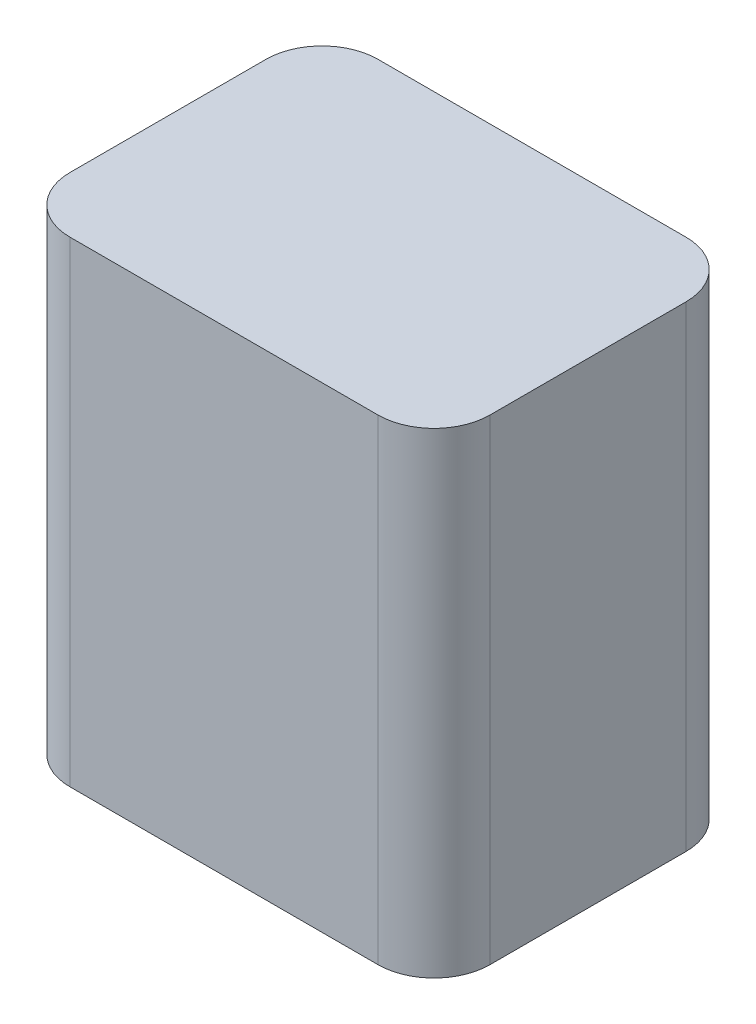
ISO-10303-21;
HEADER;
FILE_DESCRIPTION(('STEP AP214'),'2;1');
FILE_NAME('part.step','',(''),(''),'','','');
FILE_SCHEMA(('AUTOMOTIVE_DESIGN { 1 0 10303 214 1 1 1 1 }'));
ENDSEC;
DATA;
#1=APPLICATION_CONTEXT('core data for automotive mechanical design processes');
#2=APPLICATION_PROTOCOL_DEFINITION('international standard','automotive_design',2000,#1);
#3=PRODUCT_CONTEXT('',#1,'mechanical');
#4=PRODUCT('Part','Part','',(#3));
#5=PRODUCT_RELATED_PRODUCT_CATEGORY('part','',(#4));
#6=PRODUCT_DEFINITION_FORMATION('','',#4);
#7=PRODUCT_DEFINITION_CONTEXT('part definition',#1,'design');
#8=PRODUCT_DEFINITION('design','',#6,#7);
#9=PRODUCT_DEFINITION_SHAPE('','',#8);
#10=(LENGTH_UNIT() NAMED_UNIT(*) SI_UNIT(.MILLI.,.METRE.));
#11=(NAMED_UNIT(*) PLANE_ANGLE_UNIT() SI_UNIT($,.RADIAN.));
#12=(NAMED_UNIT(*) SI_UNIT($,.STERADIAN.) SOLID_ANGLE_UNIT());
#13=UNCERTAINTY_MEASURE_WITH_UNIT(LENGTH_MEASURE(1.E-05),#10,'distance_accuracy_value','');
#14=(GEOMETRIC_REPRESENTATION_CONTEXT(3) GLOBAL_UNCERTAINTY_ASSIGNED_CONTEXT((#13)) GLOBAL_UNIT_ASSIGNED_CONTEXT((#10,
#11,#12)) REPRESENTATION_CONTEXT('',''));
#15=CARTESIAN_POINT('',(0.,0.,0.));
#16=DIRECTION('',(0.,0.,1.));
#17=DIRECTION('',(1.,0.,0.));
#18=AXIS2_PLACEMENT_3D('',#15,#16,#17);
#19=CARTESIAN_POINT('',(-20.5199783886653,8.53159851301115,11.));
#20=DIRECTION('',(1.,0.,0.));
#21=DIRECTION('',(0.,0.,-1.));
#22=AXIS2_PLACEMENT_3D('',#19,#20,#21);
#23=PLANE('',#22);
#24=DIRECTION('',(0.,0.,-1.));
#25=VECTOR('',#24,1.);
#26=CARTESIAN_POINT('',(-20.5199783886653,8.53159851301115,11.));
#27=LINE('',#26,#25);
#28=CARTESIAN_POINT('',(-20.5199783886653,8.53159851301115,9.));
#29=VERTEX_POINT('',#28);
#30=CARTESIAN_POINT('',(-20.5199783886653,8.53159851301115,2.));
#31=VERTEX_POINT('',#30);
#32=EDGE_CURVE('E120',#29,#31,#27,.T.);
#33=ORIENTED_EDGE('',*,*,#32,.T.);
#34=DIRECTION('',(0.,-1.,0.));
#35=VECTOR('',#34,1.);
#36=CARTESIAN_POINT('',(-20.5199783886653,8.53159851301115,2.));
#37=LINE('',#36,#35);
#38=CARTESIAN_POINT('',(-20.5199783886653,-8.46840148698885,2.));
#39=VERTEX_POINT('',#38);
#40=EDGE_CURVE('E11',#31,#39,#37,.T.);
#41=ORIENTED_EDGE('',*,*,#40,.T.);
#42=DIRECTION('',(0.,0.,-1.));
#43=VECTOR('',#42,1.);
#44=CARTESIAN_POINT('',(-20.5199783886653,-8.46840148698885,11.));
#45=LINE('',#44,#43);
#46=CARTESIAN_POINT('',(-20.5199783886653,-8.46840148698885,9.));
#47=VERTEX_POINT('',#46);
#48=EDGE_CURVE('E125',#47,#39,#45,.T.);
#49=ORIENTED_EDGE('',*,*,#48,.F.);
#50=DIRECTION('',(0.,-1.,0.));
#51=VECTOR('',#50,1.);
#52=CARTESIAN_POINT('',(-20.5199783886653,8.53159851301115,9.));
#53=LINE('',#52,#51);
#54=EDGE_CURVE('E40',#47,#29,#53,.F.);
#55=ORIENTED_EDGE('',*,*,#54,.T.);
#56=EDGE_LOOP('',(#33,#41,#49,#55));
#57=FACE_BOUND('',#56,.T.);
#58=ADVANCED_FACE('F32',(#57),#23,.F.);
#59=CARTESIAN_POINT('',(-20.5199783886653,-8.46840148698885,11.));
#60=DIRECTION('',(0.,1.,0.));
#61=DIRECTION('',(-1.,0.,0.));
#62=AXIS2_PLACEMENT_3D('',#59,#60,#61);
#63=PLANE('',#62);
#64=DIRECTION('',(1.,0.,0.));
#65=VECTOR('',#64,1.);
#66=CARTESIAN_POINT('',(-20.5199783886653,-8.46840148698885,0.));
#67=LINE('',#66,#65);
#68=CARTESIAN_POINT('',(-18.5199783886653,-8.46840148698885,0.));
#69=VERTEX_POINT('',#68);
#70=CARTESIAN_POINT('',(-7.51997838866533,-8.46840148698885,0.));
#71=VERTEX_POINT('',#70);
#72=EDGE_CURVE('E167',#69,#71,#67,.T.);
#73=ORIENTED_EDGE('',*,*,#72,.T.);
#74=CARTESIAN_POINT('',(-7.51997838866533,-8.46840148698885,2.));
#75=DIRECTION('',(0.,1.,0.));
#76=DIRECTION('',(-1.,0.,0.));
#77=AXIS2_PLACEMENT_3D('',#74,#75,#76);
#78=CIRCLE('',#77,2.);
#79=CARTESIAN_POINT('',(-5.51997838866533,-8.46840148698885,2.));
#80=VERTEX_POINT('',#79);
#81=EDGE_CURVE('E142',#71,#80,#78,.F.);
#82=ORIENTED_EDGE('',*,*,#81,.T.);
#83=DIRECTION('',(0.,0.,-1.));
#84=VECTOR('',#83,1.);
#85=CARTESIAN_POINT('',(-5.51997838866533,-8.46840148698885,11.));
#86=LINE('',#85,#84);
#87=CARTESIAN_POINT('',(-5.51997838866533,-8.46840148698885,9.));
#88=VERTEX_POINT('',#87);
#89=EDGE_CURVE('E119',#88,#80,#86,.T.);
#90=ORIENTED_EDGE('',*,*,#89,.F.);
#91=CARTESIAN_POINT('',(-7.51997838866533,-8.46840148698885,9.));
#92=DIRECTION('',(0.,1.,0.));
#93=DIRECTION('',(-1.,0.,0.));
#94=AXIS2_PLACEMENT_3D('',#91,#92,#93);
#95=CIRCLE('',#94,2.);
#96=CARTESIAN_POINT('',(-7.51997838866533,-8.46840148698885,11.));
#97=VERTEX_POINT('',#96);
#98=EDGE_CURVE('E124',#88,#97,#95,.F.);
#99=ORIENTED_EDGE('',*,*,#98,.T.);
#100=DIRECTION('',(1.,0.,0.));
#101=VECTOR('',#100,1.);
#102=CARTESIAN_POINT('',(-20.5199783886653,-8.46840148698885,11.));
#103=LINE('',#102,#101);
#104=CARTESIAN_POINT('',(-18.5199783886653,-8.46840148698885,11.));
#105=VERTEX_POINT('',#104);
#106=EDGE_CURVE('E161',#105,#97,#103,.T.);
#107=ORIENTED_EDGE('',*,*,#106,.F.);
#108=CARTESIAN_POINT('',(-18.5199783886653,-8.46840148698885,9.));
#109=DIRECTION('',(0.,1.,0.));
#110=DIRECTION('',(-1.,0.,0.));
#111=AXIS2_PLACEMENT_3D('',#108,#109,#110);
#112=CIRCLE('',#111,2.);
#113=EDGE_CURVE('E54',#105,#47,#112,.F.);
#114=ORIENTED_EDGE('',*,*,#113,.T.);
#115=ORIENTED_EDGE('',*,*,#48,.T.);
#116=CARTESIAN_POINT('',(-18.5199783886653,-8.46840148698885,2.));
#117=DIRECTION('',(0.,1.,0.));
#118=DIRECTION('',(-1.,0.,0.));
#119=AXIS2_PLACEMENT_3D('',#116,#117,#118);
#120=CIRCLE('',#119,2.);
#121=EDGE_CURVE('E47',#39,#69,#120,.F.);
#122=ORIENTED_EDGE('',*,*,#121,.T.);
#123=EDGE_LOOP('',(#73,#82,#90,#99,#107,#114,#115,#122));
#124=FACE_BOUND('',#123,.T.);
#125=ADVANCED_FACE('F163',(#124),#63,.F.);
#126=CARTESIAN_POINT('',(-5.51997838866533,8.53159851301115,11.));
#127=DIRECTION('',(-1.,0.,0.));
#128=DIRECTION('',(0.,0.,1.));
#129=AXIS2_PLACEMENT_3D('',#126,#127,#128);
#130=PLANE('',#129);
#131=ORIENTED_EDGE('',*,*,#89,.T.);
#132=DIRECTION('',(0.,1.,0.));
#133=VECTOR('',#132,1.);
#134=CARTESIAN_POINT('',(-5.51997838866533,8.53159851301115,2.));
#135=LINE('',#134,#133);
#136=CARTESIAN_POINT('',(-5.51997838866533,8.53159851301115,2.));
#137=VERTEX_POINT('',#136);
#138=EDGE_CURVE('E118',#80,#137,#135,.T.);
#139=ORIENTED_EDGE('',*,*,#138,.T.);
#140=DIRECTION('',(0.,0.,-1.));
#141=VECTOR('',#140,1.);
#142=CARTESIAN_POINT('',(-5.51997838866533,8.53159851301115,11.));
#143=LINE('',#142,#141);
#144=CARTESIAN_POINT('',(-5.51997838866533,8.53159851301115,9.));
#145=VERTEX_POINT('',#144);
#146=EDGE_CURVE('E101',#145,#137,#143,.T.);
#147=ORIENTED_EDGE('',*,*,#146,.F.);
#148=DIRECTION('',(0.,1.,0.));
#149=VECTOR('',#148,1.);
#150=CARTESIAN_POINT('',(-5.51997838866533,-8.46840148698885,9.));
#151=LINE('',#150,#149);
#152=EDGE_CURVE('E115',#145,#88,#151,.F.);
#153=ORIENTED_EDGE('',*,*,#152,.T.);
#154=EDGE_LOOP('',(#131,#139,#147,#153));
#155=FACE_BOUND('',#154,.T.);
#156=ADVANCED_FACE('F114',(#155),#130,.F.);
#157=CARTESIAN_POINT('',(-20.5199783886653,8.53159851301115,11.));
#158=DIRECTION('',(0.,-1.,0.));
#159=DIRECTION('',(0.,0.,-1.));
#160=AXIS2_PLACEMENT_3D('',#157,#158,#159);
#161=PLANE('',#160);
#162=ORIENTED_EDGE('',*,*,#146,.T.);
#163=CARTESIAN_POINT('',(-7.51997838866533,8.53159851301115,2.));
#164=DIRECTION('',(0.,-1.,0.));
#165=DIRECTION('',(0.,0.,-1.));
#166=AXIS2_PLACEMENT_3D('',#163,#164,#165);
#167=CIRCLE('',#166,2.);
#168=CARTESIAN_POINT('',(-7.51997838866533,8.53159851301115,0.));
#169=VERTEX_POINT('',#168);
#170=EDGE_CURVE('E108',#137,#169,#167,.F.);
#171=ORIENTED_EDGE('',*,*,#170,.T.);
#172=DIRECTION('',(-1.,0.,0.));
#173=VECTOR('',#172,1.);
#174=CARTESIAN_POINT('',(-20.5199783886653,8.53159851301115,0.));
#175=LINE('',#174,#173);
#176=CARTESIAN_POINT('',(-18.5199783886653,8.53159851301115,0.));
#177=VERTEX_POINT('',#176);
#178=EDGE_CURVE('E164',#169,#177,#175,.T.);
#179=ORIENTED_EDGE('',*,*,#178,.T.);
#180=CARTESIAN_POINT('',(-18.5199783886653,8.53159851301115,2.));
#181=DIRECTION('',(0.,-1.,0.));
#182=DIRECTION('',(0.,0.,-1.));
#183=AXIS2_PLACEMENT_3D('',#180,#181,#182);
#184=CIRCLE('',#183,2.);
#185=EDGE_CURVE('E109',#177,#31,#184,.F.);
#186=ORIENTED_EDGE('',*,*,#185,.T.);
#187=ORIENTED_EDGE('',*,*,#32,.F.);
#188=CARTESIAN_POINT('',(-18.5199783886653,8.53159851301115,9.));
#189=DIRECTION('',(0.,-1.,0.));
#190=DIRECTION('',(0.,0.,-1.));
#191=AXIS2_PLACEMENT_3D('',#188,#189,#190);
#192=CIRCLE('',#191,2.);
#193=CARTESIAN_POINT('',(-18.5199783886653,8.53159851301115,11.));
#194=VERTEX_POINT('',#193);
#195=EDGE_CURVE('E127',#29,#194,#192,.F.);
#196=ORIENTED_EDGE('',*,*,#195,.T.);
#197=DIRECTION('',(-1.,0.,0.));
#198=VECTOR('',#197,1.);
#199=CARTESIAN_POINT('',(-20.5199783886653,8.53159851301115,11.));
#200=LINE('',#199,#198);
#201=CARTESIAN_POINT('',(-7.51997838866533,8.53159851301115,11.));
#202=VERTEX_POINT('',#201);
#203=EDGE_CURVE('E103',#202,#194,#200,.T.);
#204=ORIENTED_EDGE('',*,*,#203,.F.);
#205=CARTESIAN_POINT('',(-7.51997838866533,8.53159851301115,9.));
#206=DIRECTION('',(0.,-1.,0.));
#207=DIRECTION('',(0.,0.,-1.));
#208=AXIS2_PLACEMENT_3D('',#205,#206,#207);
#209=CIRCLE('',#208,2.);
#210=EDGE_CURVE('E98',#202,#145,#209,.F.);
#211=ORIENTED_EDGE('',*,*,#210,.T.);
#212=EDGE_LOOP('',(#162,#171,#179,#186,#187,#196,#204,#211));
#213=FACE_BOUND('',#212,.T.);
#214=ADVANCED_FACE('F100',(#213),#161,.F.);
#215=CARTESIAN_POINT('',(0.,0.,11.));
#216=DIRECTION('',(0.,0.,1.));
#217=DIRECTION('',(1.,0.,0.));
#218=AXIS2_PLACEMENT_3D('',#215,#216,#217);
#219=PLANE('',#218);
#220=ORIENTED_EDGE('',*,*,#106,.T.);
#221=DIRECTION('',(0.,1.,0.));
#222=VECTOR('',#221,1.);
#223=CARTESIAN_POINT('',(-7.51997838866533,8.53159851301115,11.));
#224=LINE('',#223,#222);
#225=EDGE_CURVE('E147',#97,#202,#224,.T.);
#226=ORIENTED_EDGE('',*,*,#225,.T.);
#227=ORIENTED_EDGE('',*,*,#203,.T.);
#228=DIRECTION('',(0.,-1.,0.));
#229=VECTOR('',#228,1.);
#230=CARTESIAN_POINT('',(-18.5199783886653,-8.46840148698885,11.));
#231=LINE('',#230,#229);
#232=EDGE_CURVE('E144',#194,#105,#231,.T.);
#233=ORIENTED_EDGE('',*,*,#232,.T.);
#234=EDGE_LOOP('',(#220,#226,#227,#233));
#235=FACE_BOUND('',#234,.T.);
#236=ADVANCED_FACE('F160',(#235),#219,.T.);
#237=CARTESIAN_POINT('',(0.,0.,0.));
#238=DIRECTION('',(0.,0.,1.));
#239=DIRECTION('',(1.,0.,0.));
#240=AXIS2_PLACEMENT_3D('',#237,#238,#239);
#241=PLANE('',#240);
#242=ORIENTED_EDGE('',*,*,#178,.F.);
#243=DIRECTION('',(0.,1.,0.));
#244=VECTOR('',#243,1.);
#245=CARTESIAN_POINT('',(-7.51997838866533,0.,0.));
#246=LINE('',#245,#244);
#247=EDGE_CURVE('E137',#169,#71,#246,.F.);
#248=ORIENTED_EDGE('',*,*,#247,.T.);
#249=ORIENTED_EDGE('',*,*,#72,.F.);
#250=DIRECTION('',(0.,-1.,0.));
#251=VECTOR('',#250,1.);
#252=CARTESIAN_POINT('',(-18.5199783886653,0.,0.));
#253=LINE('',#252,#251);
#254=EDGE_CURVE('E135',#69,#177,#253,.F.);
#255=ORIENTED_EDGE('',*,*,#254,.T.);
#256=EDGE_LOOP('',(#242,#248,#249,#255));
#257=FACE_BOUND('',#256,.T.);
#258=ADVANCED_FACE('F176',(#257),#241,.F.);
#259=CARTESIAN_POINT('',(-7.51997838866533,8.53159851301115,2.));
#260=DIRECTION('',(0.,1.,0.));
#261=DIRECTION('',(0.,0.,1.));
#262=AXIS2_PLACEMENT_3D('',#259,#260,#261);
#263=CYLINDRICAL_SURFACE('',#262,2.);
#264=ORIENTED_EDGE('',*,*,#81,.F.);
#265=ORIENTED_EDGE('',*,*,#247,.F.);
#266=ORIENTED_EDGE('',*,*,#170,.F.);
#267=ORIENTED_EDGE('',*,*,#138,.F.);
#268=EDGE_LOOP('',(#264,#265,#266,#267));
#269=FACE_BOUND('',#268,.T.);
#270=ADVANCED_FACE('F172',(#269),#263,.T.);
#271=CARTESIAN_POINT('',(-7.51997838866533,0.,9.));
#272=DIRECTION('',(0.,-1.,0.));
#273=DIRECTION('',(0.,0.,-1.));
#274=AXIS2_PLACEMENT_3D('',#271,#272,#273);
#275=CYLINDRICAL_SURFACE('',#274,2.);
#276=ORIENTED_EDGE('',*,*,#98,.F.);
#277=ORIENTED_EDGE('',*,*,#152,.F.);
#278=ORIENTED_EDGE('',*,*,#210,.F.);
#279=ORIENTED_EDGE('',*,*,#225,.F.);
#280=EDGE_LOOP('',(#276,#277,#278,#279));
#281=FACE_BOUND('',#280,.T.);
#282=ADVANCED_FACE('F123',(#281),#275,.T.);
#283=CARTESIAN_POINT('',(-18.5199783886653,8.53159851301115,2.));
#284=DIRECTION('',(0.,-1.,0.));
#285=DIRECTION('',(0.,0.,-1.));
#286=AXIS2_PLACEMENT_3D('',#283,#284,#285);
#287=CYLINDRICAL_SURFACE('',#286,2.);
#288=ORIENTED_EDGE('',*,*,#185,.F.);
#289=ORIENTED_EDGE('',*,*,#254,.F.);
#290=ORIENTED_EDGE('',*,*,#121,.F.);
#291=ORIENTED_EDGE('',*,*,#40,.F.);
#292=EDGE_LOOP('',(#288,#289,#290,#291));
#293=FACE_BOUND('',#292,.T.);
#294=ADVANCED_FACE('F178',(#293),#287,.T.);
#295=CARTESIAN_POINT('',(-18.5199783886653,0.,9.));
#296=DIRECTION('',(0.,1.,0.));
#297=DIRECTION('',(0.,0.,1.));
#298=AXIS2_PLACEMENT_3D('',#295,#296,#297);
#299=CYLINDRICAL_SURFACE('',#298,2.);
#300=ORIENTED_EDGE('',*,*,#195,.F.);
#301=ORIENTED_EDGE('',*,*,#54,.F.);
#302=ORIENTED_EDGE('',*,*,#113,.F.);
#303=ORIENTED_EDGE('',*,*,#232,.F.);
#304=EDGE_LOOP('',(#300,#301,#302,#303));
#305=FACE_BOUND('',#304,.T.);
#306=ADVANCED_FACE('F34',(#305),#299,.T.);
#307=CLOSED_SHELL('',(#58,#125,#156,#214,#236,#258,#270,#282,#294,#306));
#308=MANIFOLD_SOLID_BREP('B2',#307);
#309=ADVANCED_BREP_SHAPE_REPRESENTATION('',(#18,#308),#14);
#310=SHAPE_DEFINITION_REPRESENTATION(#9,#309);
ENDSEC;
END-ISO-10303-21;
